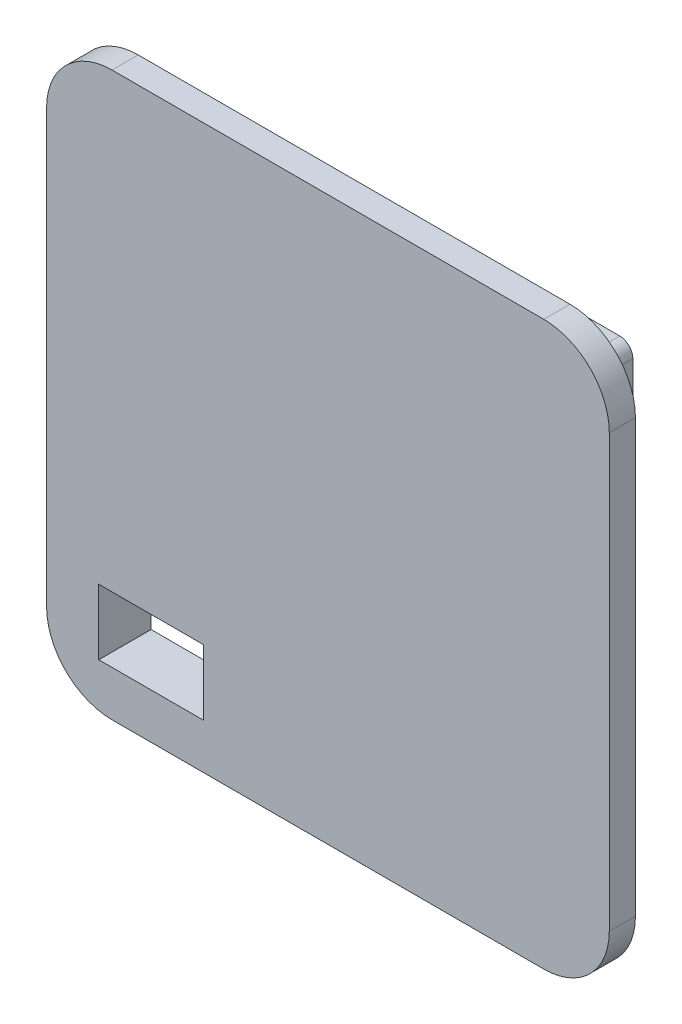
ISO-10303-21;
HEADER;
FILE_DESCRIPTION(('STEP AP214'),'2;1');
FILE_NAME('part.step','',(''),(''),'','','');
FILE_SCHEMA(('AUTOMOTIVE_DESIGN { 1 0 10303 214 1 1 1 1 }'));
ENDSEC;
DATA;
#1=APPLICATION_CONTEXT('core data for automotive mechanical design processes');
#2=APPLICATION_PROTOCOL_DEFINITION('international standard','automotive_design',2000,#1);
#3=PRODUCT_CONTEXT('',#1,'mechanical');
#4=PRODUCT('Part','Part','',(#3));
#5=PRODUCT_RELATED_PRODUCT_CATEGORY('part','',(#4));
#6=PRODUCT_DEFINITION_FORMATION('','',#4);
#7=PRODUCT_DEFINITION_CONTEXT('part definition',#1,'design');
#8=PRODUCT_DEFINITION('design','',#6,#7);
#9=PRODUCT_DEFINITION_SHAPE('','',#8);
#10=(LENGTH_UNIT() NAMED_UNIT(*) SI_UNIT(.MILLI.,.METRE.));
#11=(NAMED_UNIT(*) PLANE_ANGLE_UNIT() SI_UNIT($,.RADIAN.));
#12=(NAMED_UNIT(*) SI_UNIT($,.STERADIAN.) SOLID_ANGLE_UNIT());
#13=UNCERTAINTY_MEASURE_WITH_UNIT(LENGTH_MEASURE(1.E-05),#10,'distance_accuracy_value','');
#14=(GEOMETRIC_REPRESENTATION_CONTEXT(3) GLOBAL_UNCERTAINTY_ASSIGNED_CONTEXT((#13)) GLOBAL_UNIT_ASSIGNED_CONTEXT((#10,
#11,#12)) REPRESENTATION_CONTEXT('',''));
#15=CARTESIAN_POINT('',(0.,0.,0.));
#16=DIRECTION('',(0.,0.,1.));
#17=DIRECTION('',(1.,0.,0.));
#18=AXIS2_PLACEMENT_3D('',#15,#16,#17);
#19=CARTESIAN_POINT('',(21.5,-21.500000053,2.));
#20=DIRECTION('',(0.,1.,0.));
#21=DIRECTION('',(0.,0.,1.));
#22=AXIS2_PLACEMENT_3D('',#19,#20,#21);
#23=PLANE('',#22);
#24=DIRECTION('',(1.,0.,0.));
#25=VECTOR('',#24,1.);
#26=CARTESIAN_POINT('',(21.5,-21.500000053,0.));
#27=LINE('',#26,#25);
#28=CARTESIAN_POINT('',(-16.5,-21.500000053,0.));
#29=VERTEX_POINT('',#28);
#30=CARTESIAN_POINT('',(16.5,-21.500000053,0.));
#31=VERTEX_POINT('',#30);
#32=EDGE_CURVE('E233',#29,#31,#27,.T.);
#33=ORIENTED_EDGE('',*,*,#32,.T.);
#34=DIRECTION('',(0.,0.,-1.));
#35=VECTOR('',#34,1.);
#36=CARTESIAN_POINT('',(16.5,-21.500000053,2.));
#37=LINE('',#36,#35);
#38=CARTESIAN_POINT('',(16.5,-21.500000053,2.));
#39=VERTEX_POINT('',#38);
#40=EDGE_CURVE('E274',#31,#39,#37,.F.);
#41=ORIENTED_EDGE('',*,*,#40,.T.);
#42=DIRECTION('',(1.,0.,0.));
#43=VECTOR('',#42,1.);
#44=CARTESIAN_POINT('',(21.5,-21.500000053,2.));
#45=LINE('',#44,#43);
#46=CARTESIAN_POINT('',(-16.5,-21.500000053,2.));
#47=VERTEX_POINT('',#46);
#48=EDGE_CURVE('E237',#47,#39,#45,.T.);
#49=ORIENTED_EDGE('',*,*,#48,.F.);
#50=DIRECTION('',(0.,0.,-1.));
#51=VECTOR('',#50,1.);
#52=CARTESIAN_POINT('',(-16.5,-21.500000053,2.));
#53=LINE('',#52,#51);
#54=EDGE_CURVE('E275',#47,#29,#53,.T.);
#55=ORIENTED_EDGE('',*,*,#54,.T.);
#56=EDGE_LOOP('',(#33,#41,#49,#55));
#57=FACE_BOUND('',#56,.T.);
#58=ADVANCED_FACE('F41',(#57),#23,.F.);
#59=CARTESIAN_POINT('',(21.5,21.500000053,2.));
#60=DIRECTION('',(-1.,0.,0.));
#61=DIRECTION('',(0.,-1.,0.));
#62=AXIS2_PLACEMENT_3D('',#59,#60,#61);
#63=PLANE('',#62);
#64=DIRECTION('',(0.,1.,0.));
#65=VECTOR('',#64,1.);
#66=CARTESIAN_POINT('',(21.5,21.500000053,2.));
#67=LINE('',#66,#65);
#68=CARTESIAN_POINT('',(21.5,-16.500000053,2.));
#69=VERTEX_POINT('',#68);
#70=CARTESIAN_POINT('',(21.5,16.500000053,2.));
#71=VERTEX_POINT('',#70);
#72=EDGE_CURVE('E239',#69,#71,#67,.T.);
#73=ORIENTED_EDGE('',*,*,#72,.F.);
#74=DIRECTION('',(0.,0.,-1.));
#75=VECTOR('',#74,1.);
#76=CARTESIAN_POINT('',(21.5,-16.500000053,2.));
#77=LINE('',#76,#75);
#78=CARTESIAN_POINT('',(21.5,-16.500000053,0.));
#79=VERTEX_POINT('',#78);
#80=EDGE_CURVE('E261',#69,#79,#77,.T.);
#81=ORIENTED_EDGE('',*,*,#80,.T.);
#82=DIRECTION('',(0.,1.,0.));
#83=VECTOR('',#82,1.);
#84=CARTESIAN_POINT('',(21.5,21.500000053,0.));
#85=LINE('',#84,#83);
#86=CARTESIAN_POINT('',(21.5,16.500000053,0.));
#87=VERTEX_POINT('',#86);
#88=EDGE_CURVE('E252',#79,#87,#85,.T.);
#89=ORIENTED_EDGE('',*,*,#88,.T.);
#90=DIRECTION('',(0.,0.,-1.));
#91=VECTOR('',#90,1.);
#92=CARTESIAN_POINT('',(21.5,16.500000053,2.));
#93=LINE('',#92,#91);
#94=EDGE_CURVE('E249',#87,#71,#93,.F.);
#95=ORIENTED_EDGE('',*,*,#94,.T.);
#96=EDGE_LOOP('',(#73,#81,#89,#95));
#97=FACE_BOUND('',#96,.T.);
#98=ADVANCED_FACE('F374',(#97),#63,.F.);
#99=CARTESIAN_POINT('',(21.5,21.500000053,2.));
#100=DIRECTION('',(0.,-1.,0.));
#101=DIRECTION('',(0.,0.,-1.));
#102=AXIS2_PLACEMENT_3D('',#99,#100,#101);
#103=PLANE('',#102);
#104=DIRECTION('',(-1.,0.,0.));
#105=VECTOR('',#104,1.);
#106=CARTESIAN_POINT('',(21.5,21.500000053,0.));
#107=LINE('',#106,#105);
#108=CARTESIAN_POINT('',(16.5,21.500000053,0.));
#109=VERTEX_POINT('',#108);
#110=CARTESIAN_POINT('',(-16.5,21.500000053,0.));
#111=VERTEX_POINT('',#110);
#112=EDGE_CURVE('E254',#109,#111,#107,.T.);
#113=ORIENTED_EDGE('',*,*,#112,.T.);
#114=DIRECTION('',(0.,0.,-1.));
#115=VECTOR('',#114,1.);
#116=CARTESIAN_POINT('',(-16.5,21.500000053,2.));
#117=LINE('',#116,#115);
#118=CARTESIAN_POINT('',(-16.5,21.500000053,2.));
#119=VERTEX_POINT('',#118);
#120=EDGE_CURVE('E291',#111,#119,#117,.F.);
#121=ORIENTED_EDGE('',*,*,#120,.T.);
#122=DIRECTION('',(-1.,0.,0.));
#123=VECTOR('',#122,1.);
#124=CARTESIAN_POINT('',(21.5,21.500000053,2.));
#125=LINE('',#124,#123);
#126=CARTESIAN_POINT('',(16.5,21.500000053,2.));
#127=VERTEX_POINT('',#126);
#128=EDGE_CURVE('E242',#127,#119,#125,.T.);
#129=ORIENTED_EDGE('',*,*,#128,.F.);
#130=DIRECTION('',(0.,0.,-1.));
#131=VECTOR('',#130,1.);
#132=CARTESIAN_POINT('',(16.5,21.500000053,2.));
#133=LINE('',#132,#131);
#134=EDGE_CURVE('E287',#127,#109,#133,.T.);
#135=ORIENTED_EDGE('',*,*,#134,.T.);
#136=EDGE_LOOP('',(#113,#121,#129,#135));
#137=FACE_BOUND('',#136,.T.);
#138=ADVANCED_FACE('F381',(#137),#103,.F.);
#139=CARTESIAN_POINT('',(-21.5,21.500000053,2.));
#140=DIRECTION('',(1.,0.,0.));
#141=DIRECTION('',(0.,1.,0.));
#142=AXIS2_PLACEMENT_3D('',#139,#140,#141);
#143=PLANE('',#142);
#144=DIRECTION('',(0.,-1.,0.));
#145=VECTOR('',#144,1.);
#146=CARTESIAN_POINT('',(-21.5,21.500000053,0.));
#147=LINE('',#146,#145);
#148=CARTESIAN_POINT('',(-21.5,16.500000053,0.));
#149=VERTEX_POINT('',#148);
#150=CARTESIAN_POINT('',(-21.5,-16.500000053,0.));
#151=VERTEX_POINT('',#150);
#152=EDGE_CURVE('E238',#149,#151,#147,.T.);
#153=ORIENTED_EDGE('',*,*,#152,.T.);
#154=DIRECTION('',(0.,0.,-1.));
#155=VECTOR('',#154,1.);
#156=CARTESIAN_POINT('',(-21.5,-16.500000053,2.));
#157=LINE('',#156,#155);
#158=CARTESIAN_POINT('',(-21.5,-16.500000053,2.));
#159=VERTEX_POINT('',#158);
#160=EDGE_CURVE('E286',#151,#159,#157,.F.);
#161=ORIENTED_EDGE('',*,*,#160,.T.);
#162=DIRECTION('',(0.,-1.,0.));
#163=VECTOR('',#162,1.);
#164=CARTESIAN_POINT('',(-21.5,21.500000053,2.));
#165=LINE('',#164,#163);
#166=CARTESIAN_POINT('',(-21.5,16.500000053,2.));
#167=VERTEX_POINT('',#166);
#168=EDGE_CURVE('E248',#167,#159,#165,.T.);
#169=ORIENTED_EDGE('',*,*,#168,.F.);
#170=DIRECTION('',(0.,0.,-1.));
#171=VECTOR('',#170,1.);
#172=CARTESIAN_POINT('',(-21.5,16.500000053,2.));
#173=LINE('',#172,#171);
#174=EDGE_CURVE('E281',#167,#149,#173,.T.);
#175=ORIENTED_EDGE('',*,*,#174,.T.);
#176=EDGE_LOOP('',(#153,#161,#169,#175));
#177=FACE_BOUND('',#176,.T.);
#178=ADVANCED_FACE('F425',(#177),#143,.F.);
#179=CARTESIAN_POINT('',(0.,0.,2.));
#180=DIRECTION('',(0.,0.,1.));
#181=DIRECTION('',(1.,0.,0.));
#182=AXIS2_PLACEMENT_3D('',#179,#180,#181);
#183=PLANE('',#182);
#184=DIRECTION('',(0.,-1.,0.));
#185=VECTOR('',#184,1.);
#186=CARTESIAN_POINT('',(-17.5127004724193,-18.0345781282387,2.));
#187=LINE('',#186,#185);
#188=CARTESIAN_POINT('',(-17.5127004724193,-13.0345781282387,2.));
#189=VERTEX_POINT('',#188);
#190=CARTESIAN_POINT('',(-17.5127004724193,-18.0345781282387,2.));
#191=VERTEX_POINT('',#190);
#192=EDGE_CURVE('E211',#189,#191,#187,.T.);
#193=ORIENTED_EDGE('',*,*,#192,.F.);
#194=DIRECTION('',(-1.,0.,0.));
#195=VECTOR('',#194,1.);
#196=CARTESIAN_POINT('',(-9.51270047241934,-13.0345781282387,2.));
#197=LINE('',#196,#195);
#198=CARTESIAN_POINT('',(-9.51270047241934,-13.0345781282387,2.));
#199=VERTEX_POINT('',#198);
#200=EDGE_CURVE('E227',#199,#189,#197,.T.);
#201=ORIENTED_EDGE('',*,*,#200,.F.);
#202=DIRECTION('',(0.,1.,0.));
#203=VECTOR('',#202,1.);
#204=CARTESIAN_POINT('',(-9.51270047241934,-18.0345781282387,2.));
#205=LINE('',#204,#203);
#206=CARTESIAN_POINT('',(-9.51270047241934,-18.0345781282387,2.));
#207=VERTEX_POINT('',#206);
#208=EDGE_CURVE('E181',#207,#199,#205,.T.);
#209=ORIENTED_EDGE('',*,*,#208,.F.);
#210=DIRECTION('',(1.,0.,0.));
#211=VECTOR('',#210,1.);
#212=CARTESIAN_POINT('',(-9.51270047241934,-18.0345781282387,2.));
#213=LINE('',#212,#211);
#214=EDGE_CURVE('E221',#191,#207,#213,.T.);
#215=ORIENTED_EDGE('',*,*,#214,.F.);
#216=EDGE_LOOP('',(#193,#201,#209,#215));
#217=FACE_BOUND('',#216,.T.);
#218=ORIENTED_EDGE('',*,*,#48,.T.);
#219=CARTESIAN_POINT('',(16.5,-16.500000053,2.));
#220=DIRECTION('',(0.,0.,1.));
#221=DIRECTION('',(1.,0.,0.));
#222=AXIS2_PLACEMENT_3D('',#219,#220,#221);
#223=CIRCLE('',#222,5.);
#224=EDGE_CURVE('E282',#39,#69,#223,.T.);
#225=ORIENTED_EDGE('',*,*,#224,.T.);
#226=ORIENTED_EDGE('',*,*,#72,.T.);
#227=CARTESIAN_POINT('',(16.5,16.500000053,2.));
#228=DIRECTION('',(0.,0.,1.));
#229=DIRECTION('',(1.,0.,0.));
#230=AXIS2_PLACEMENT_3D('',#227,#228,#229);
#231=CIRCLE('',#230,5.);
#232=EDGE_CURVE('E280',#71,#127,#231,.T.);
#233=ORIENTED_EDGE('',*,*,#232,.T.);
#234=ORIENTED_EDGE('',*,*,#128,.T.);
#235=CARTESIAN_POINT('',(-16.5,16.500000053,2.));
#236=DIRECTION('',(0.,0.,1.));
#237=DIRECTION('',(1.,0.,0.));
#238=AXIS2_PLACEMENT_3D('',#235,#236,#237);
#239=CIRCLE('',#238,5.);
#240=EDGE_CURVE('E276',#119,#167,#239,.T.);
#241=ORIENTED_EDGE('',*,*,#240,.T.);
#242=ORIENTED_EDGE('',*,*,#168,.T.);
#243=CARTESIAN_POINT('',(-16.5,-16.500000053,2.));
#244=DIRECTION('',(0.,0.,1.));
#245=DIRECTION('',(1.,0.,0.));
#246=AXIS2_PLACEMENT_3D('',#243,#244,#245);
#247=CIRCLE('',#246,5.);
#248=EDGE_CURVE('E283',#159,#47,#247,.T.);
#249=ORIENTED_EDGE('',*,*,#248,.T.);
#250=EDGE_LOOP('',(#218,#225,#226,#233,#234,#241,#242,#249));
#251=FACE_BOUND('',#250,.T.);
#252=ADVANCED_FACE('F415',(#217,#251),#183,.T.);
#253=CARTESIAN_POINT('',(0.,0.,0.));
#254=DIRECTION('',(0.,0.,1.));
#255=DIRECTION('',(1.,0.,0.));
#256=AXIS2_PLACEMENT_3D('',#253,#254,#255);
#257=PLANE('',#256);
#258=DIRECTION('',(1.,0.,0.));
#259=VECTOR('',#258,1.);
#260=CARTESIAN_POINT('',(0.,19.3,0.));
#261=LINE('',#260,#259);
#262=CARTESIAN_POINT('',(-18.3,19.3,0.));
#263=VERTEX_POINT('',#262);
#264=CARTESIAN_POINT('',(18.3,19.3,0.));
#265=VERTEX_POINT('',#264);
#266=EDGE_CURVE('E212',#263,#265,#261,.T.);
#267=ORIENTED_EDGE('',*,*,#266,.F.);
#268=CARTESIAN_POINT('',(-18.3,18.3,0.));
#269=DIRECTION('',(0.,0.,1.));
#270=DIRECTION('',(1.,0.,0.));
#271=AXIS2_PLACEMENT_3D('',#268,#269,#270);
#272=CIRCLE('',#271,1.);
#273=CARTESIAN_POINT('',(-19.3,18.3,0.));
#274=VERTEX_POINT('',#273);
#275=EDGE_CURVE('E325',#263,#274,#272,.T.);
#276=ORIENTED_EDGE('',*,*,#275,.T.);
#277=DIRECTION('',(0.,-1.,0.));
#278=VECTOR('',#277,1.);
#279=CARTESIAN_POINT('',(-19.3,0.,0.));
#280=LINE('',#279,#278);
#281=CARTESIAN_POINT('',(-19.3,-18.3,0.));
#282=VERTEX_POINT('',#281);
#283=EDGE_CURVE('E215',#274,#282,#280,.T.);
#284=ORIENTED_EDGE('',*,*,#283,.T.);
#285=CARTESIAN_POINT('',(-18.3,-18.3,0.));
#286=DIRECTION('',(0.,0.,1.));
#287=DIRECTION('',(1.,0.,0.));
#288=AXIS2_PLACEMENT_3D('',#285,#286,#287);
#289=CIRCLE('',#288,1.);
#290=CARTESIAN_POINT('',(-18.3,-19.3,0.));
#291=VERTEX_POINT('',#290);
#292=EDGE_CURVE('E11',#282,#291,#289,.T.);
#293=ORIENTED_EDGE('',*,*,#292,.T.);
#294=DIRECTION('',(1.,0.,0.));
#295=VECTOR('',#294,1.);
#296=CARTESIAN_POINT('',(0.,-19.3,0.));
#297=LINE('',#296,#295);
#298=CARTESIAN_POINT('',(18.3,-19.3,0.));
#299=VERTEX_POINT('',#298);
#300=EDGE_CURVE('E219',#291,#299,#297,.T.);
#301=ORIENTED_EDGE('',*,*,#300,.T.);
#302=CARTESIAN_POINT('',(18.3,-18.3,0.));
#303=DIRECTION('',(0.,0.,1.));
#304=DIRECTION('',(1.,0.,0.));
#305=AXIS2_PLACEMENT_3D('',#302,#303,#304);
#306=CIRCLE('',#305,1.);
#307=CARTESIAN_POINT('',(19.3,-18.3,0.));
#308=VERTEX_POINT('',#307);
#309=EDGE_CURVE('E47',#299,#308,#306,.T.);
#310=ORIENTED_EDGE('',*,*,#309,.T.);
#311=DIRECTION('',(0.,-1.,0.));
#312=VECTOR('',#311,1.);
#313=CARTESIAN_POINT('',(19.3,0.,0.));
#314=LINE('',#313,#312);
#315=CARTESIAN_POINT('',(19.3,18.3,0.));
#316=VERTEX_POINT('',#315);
#317=EDGE_CURVE('E220',#316,#308,#314,.T.);
#318=ORIENTED_EDGE('',*,*,#317,.F.);
#319=CARTESIAN_POINT('',(18.3,18.3,0.));
#320=DIRECTION('',(0.,0.,1.));
#321=DIRECTION('',(1.,0.,0.));
#322=AXIS2_PLACEMENT_3D('',#319,#320,#321);
#323=CIRCLE('',#322,1.);
#324=EDGE_CURVE('E322',#316,#265,#323,.T.);
#325=ORIENTED_EDGE('',*,*,#324,.T.);
#326=EDGE_LOOP('',(#267,#276,#284,#293,#301,#310,#318,#325));
#327=FACE_BOUND('',#326,.T.);
#328=ORIENTED_EDGE('',*,*,#88,.F.);
#329=CARTESIAN_POINT('',(16.5,-16.500000053,0.));
#330=DIRECTION('',(0.,0.,1.));
#331=DIRECTION('',(1.,0.,0.));
#332=AXIS2_PLACEMENT_3D('',#329,#330,#331);
#333=CIRCLE('',#332,5.);
#334=EDGE_CURVE('E269',#79,#31,#333,.F.);
#335=ORIENTED_EDGE('',*,*,#334,.T.);
#336=ORIENTED_EDGE('',*,*,#32,.F.);
#337=CARTESIAN_POINT('',(-16.5,-16.500000053,0.));
#338=DIRECTION('',(0.,0.,1.));
#339=DIRECTION('',(1.,0.,0.));
#340=AXIS2_PLACEMENT_3D('',#337,#338,#339);
#341=CIRCLE('',#340,5.);
#342=EDGE_CURVE('E268',#29,#151,#341,.F.);
#343=ORIENTED_EDGE('',*,*,#342,.T.);
#344=ORIENTED_EDGE('',*,*,#152,.F.);
#345=CARTESIAN_POINT('',(-16.5,16.500000053,0.));
#346=DIRECTION('',(0.,0.,1.));
#347=DIRECTION('',(1.,0.,0.));
#348=AXIS2_PLACEMENT_3D('',#345,#346,#347);
#349=CIRCLE('',#348,5.);
#350=EDGE_CURVE('E266',#149,#111,#349,.F.);
#351=ORIENTED_EDGE('',*,*,#350,.T.);
#352=ORIENTED_EDGE('',*,*,#112,.F.);
#353=CARTESIAN_POINT('',(16.5,16.500000053,0.));
#354=DIRECTION('',(0.,0.,1.));
#355=DIRECTION('',(1.,0.,0.));
#356=AXIS2_PLACEMENT_3D('',#353,#354,#355);
#357=CIRCLE('',#356,5.);
#358=EDGE_CURVE('E262',#109,#87,#357,.F.);
#359=ORIENTED_EDGE('',*,*,#358,.T.);
#360=EDGE_LOOP('',(#328,#335,#336,#343,#344,#351,#352,#359));
#361=FACE_BOUND('',#360,.T.);
#362=ADVANCED_FACE('F330',(#327,#361),#257,.F.);
#363=CARTESIAN_POINT('',(16.5,-16.500000053,2.));
#364=DIRECTION('',(0.,0.,-1.));
#365=DIRECTION('',(-1.,0.,0.));
#366=AXIS2_PLACEMENT_3D('',#363,#364,#365);
#367=CYLINDRICAL_SURFACE('',#366,5.);
#368=ORIENTED_EDGE('',*,*,#224,.F.);
#369=ORIENTED_EDGE('',*,*,#40,.F.);
#370=ORIENTED_EDGE('',*,*,#334,.F.);
#371=ORIENTED_EDGE('',*,*,#80,.F.);
#372=EDGE_LOOP('',(#368,#369,#370,#371));
#373=FACE_BOUND('',#372,.T.);
#374=ADVANCED_FACE('F387',(#373),#367,.T.);
#375=CARTESIAN_POINT('',(-16.5,-16.500000053,2.));
#376=DIRECTION('',(0.,0.,-1.));
#377=DIRECTION('',(-1.,0.,0.));
#378=AXIS2_PLACEMENT_3D('',#375,#376,#377);
#379=CYLINDRICAL_SURFACE('',#378,5.);
#380=ORIENTED_EDGE('',*,*,#248,.F.);
#381=ORIENTED_EDGE('',*,*,#160,.F.);
#382=ORIENTED_EDGE('',*,*,#342,.F.);
#383=ORIENTED_EDGE('',*,*,#54,.F.);
#384=EDGE_LOOP('',(#380,#381,#382,#383));
#385=FACE_BOUND('',#384,.T.);
#386=ADVANCED_FACE('F386',(#385),#379,.T.);
#387=CARTESIAN_POINT('',(-16.5,16.500000053,2.));
#388=DIRECTION('',(0.,0.,-1.));
#389=DIRECTION('',(-1.,0.,0.));
#390=AXIS2_PLACEMENT_3D('',#387,#388,#389);
#391=CYLINDRICAL_SURFACE('',#390,5.);
#392=ORIENTED_EDGE('',*,*,#240,.F.);
#393=ORIENTED_EDGE('',*,*,#120,.F.);
#394=ORIENTED_EDGE('',*,*,#350,.F.);
#395=ORIENTED_EDGE('',*,*,#174,.F.);
#396=EDGE_LOOP('',(#392,#393,#394,#395));
#397=FACE_BOUND('',#396,.T.);
#398=ADVANCED_FACE('F392',(#397),#391,.T.);
#399=CARTESIAN_POINT('',(16.5,16.500000053,2.));
#400=DIRECTION('',(0.,0.,-1.));
#401=DIRECTION('',(-1.,0.,0.));
#402=AXIS2_PLACEMENT_3D('',#399,#400,#401);
#403=CYLINDRICAL_SURFACE('',#402,5.);
#404=ORIENTED_EDGE('',*,*,#232,.F.);
#405=ORIENTED_EDGE('',*,*,#94,.F.);
#406=ORIENTED_EDGE('',*,*,#358,.F.);
#407=ORIENTED_EDGE('',*,*,#134,.F.);
#408=EDGE_LOOP('',(#404,#405,#406,#407));
#409=FACE_BOUND('',#408,.T.);
#410=ADVANCED_FACE('F398',(#409),#403,.T.);
#411=CARTESIAN_POINT('',(-17.5127004724193,-18.0345781282387,0.));
#412=DIRECTION('',(-1.,0.,0.));
#413=DIRECTION('',(0.,0.,1.));
#414=AXIS2_PLACEMENT_3D('',#411,#412,#413);
#415=PLANE('',#414);
#416=ORIENTED_EDGE('',*,*,#192,.T.);
#417=DIRECTION('',(0.,0.,1.));
#418=VECTOR('',#417,1.);
#419=CARTESIAN_POINT('',(-17.5127004724193,-18.0345781282387,0.));
#420=LINE('',#419,#418);
#421=CARTESIAN_POINT('',(-17.5127004724193,-18.0345781282387,-2.));
#422=VERTEX_POINT('',#421);
#423=EDGE_CURVE('E226',#422,#191,#420,.T.);
#424=ORIENTED_EDGE('',*,*,#423,.F.);
#425=DIRECTION('',(0.,-1.,0.));
#426=VECTOR('',#425,1.);
#427=CARTESIAN_POINT('',(-17.5127004724193,0.,-2.));
#428=LINE('',#427,#426);
#429=CARTESIAN_POINT('',(-17.5127004724193,-13.0345781282387,-2.));
#430=VERTEX_POINT('',#429);
#431=EDGE_CURVE('E198',#430,#422,#428,.T.);
#432=ORIENTED_EDGE('',*,*,#431,.F.);
#433=DIRECTION('',(0.,0.,1.));
#434=VECTOR('',#433,1.);
#435=CARTESIAN_POINT('',(-17.5127004724193,-13.0345781282387,0.));
#436=LINE('',#435,#434);
#437=EDGE_CURVE('E189',#430,#189,#436,.T.);
#438=ORIENTED_EDGE('',*,*,#437,.T.);
#439=EDGE_LOOP('',(#416,#424,#432,#438));
#440=FACE_BOUND('',#439,.T.);
#441=ADVANCED_FACE('F399',(#440),#415,.F.);
#442=CARTESIAN_POINT('',(-9.51270047241934,-13.0345781282387,0.));
#443=DIRECTION('',(0.,1.,0.));
#444=DIRECTION('',(-1.,0.,0.));
#445=AXIS2_PLACEMENT_3D('',#442,#443,#444);
#446=PLANE('',#445);
#447=ORIENTED_EDGE('',*,*,#200,.T.);
#448=ORIENTED_EDGE('',*,*,#437,.F.);
#449=DIRECTION('',(-1.,0.,0.));
#450=VECTOR('',#449,1.);
#451=CARTESIAN_POINT('',(0.,-13.0345781282387,-2.));
#452=LINE('',#451,#450);
#453=CARTESIAN_POINT('',(-9.51270047241934,-13.0345781282387,-2.));
#454=VERTEX_POINT('',#453);
#455=EDGE_CURVE('E193',#454,#430,#452,.T.);
#456=ORIENTED_EDGE('',*,*,#455,.F.);
#457=DIRECTION('',(0.,0.,1.));
#458=VECTOR('',#457,1.);
#459=CARTESIAN_POINT('',(-9.51270047241934,-13.0345781282387,0.));
#460=LINE('',#459,#458);
#461=EDGE_CURVE('E180',#454,#199,#460,.T.);
#462=ORIENTED_EDGE('',*,*,#461,.T.);
#463=EDGE_LOOP('',(#447,#448,#456,#462));
#464=FACE_BOUND('',#463,.T.);
#465=ADVANCED_FACE('F195',(#464),#446,.F.);
#466=CARTESIAN_POINT('',(-9.51270047241934,-18.0345781282387,0.));
#467=DIRECTION('',(1.,0.,0.));
#468=DIRECTION('',(0.,0.,-1.));
#469=AXIS2_PLACEMENT_3D('',#466,#467,#468);
#470=PLANE('',#469);
#471=ORIENTED_EDGE('',*,*,#208,.T.);
#472=ORIENTED_EDGE('',*,*,#461,.F.);
#473=DIRECTION('',(0.,1.,0.));
#474=VECTOR('',#473,1.);
#475=CARTESIAN_POINT('',(-9.51270047241934,0.,-2.));
#476=LINE('',#475,#474);
#477=CARTESIAN_POINT('',(-9.51270047241934,-18.0345781282387,-2.));
#478=VERTEX_POINT('',#477);
#479=EDGE_CURVE('E182',#478,#454,#476,.T.);
#480=ORIENTED_EDGE('',*,*,#479,.F.);
#481=DIRECTION('',(0.,0.,1.));
#482=VECTOR('',#481,1.);
#483=CARTESIAN_POINT('',(-9.51270047241934,-18.0345781282387,0.));
#484=LINE('',#483,#482);
#485=EDGE_CURVE('E187',#478,#207,#484,.T.);
#486=ORIENTED_EDGE('',*,*,#485,.T.);
#487=EDGE_LOOP('',(#471,#472,#480,#486));
#488=FACE_BOUND('',#487,.T.);
#489=ADVANCED_FACE('F179',(#488),#470,.F.);
#490=CARTESIAN_POINT('',(-9.51270047241934,-18.0345781282387,0.));
#491=DIRECTION('',(0.,-1.,0.));
#492=DIRECTION('',(0.,0.,-1.));
#493=AXIS2_PLACEMENT_3D('',#490,#491,#492);
#494=PLANE('',#493);
#495=ORIENTED_EDGE('',*,*,#214,.T.);
#496=ORIENTED_EDGE('',*,*,#485,.F.);
#497=DIRECTION('',(1.,0.,0.));
#498=VECTOR('',#497,1.);
#499=CARTESIAN_POINT('',(0.,-18.0345781282387,-2.));
#500=LINE('',#499,#498);
#501=EDGE_CURVE('E203',#422,#478,#500,.T.);
#502=ORIENTED_EDGE('',*,*,#501,.F.);
#503=ORIENTED_EDGE('',*,*,#423,.T.);
#504=EDGE_LOOP('',(#495,#496,#502,#503));
#505=FACE_BOUND('',#504,.T.);
#506=ADVANCED_FACE('F503',(#505),#494,.F.);
#507=CARTESIAN_POINT('',(-19.3,0.,-2.));
#508=DIRECTION('',(-1.,0.,0.));
#509=DIRECTION('',(0.,-1.,0.));
#510=AXIS2_PLACEMENT_3D('',#507,#508,#509);
#511=PLANE('',#510);
#512=ORIENTED_EDGE('',*,*,#283,.F.);
#513=DIRECTION('',(0.,0.,1.));
#514=VECTOR('',#513,1.);
#515=CARTESIAN_POINT('',(-19.3,18.3,-2.));
#516=LINE('',#515,#514);
#517=CARTESIAN_POINT('',(-19.3,18.3,-2.));
#518=VERTEX_POINT('',#517);
#519=EDGE_CURVE('E301',#274,#518,#516,.F.);
#520=ORIENTED_EDGE('',*,*,#519,.T.);
#521=DIRECTION('',(0.,-1.,0.));
#522=VECTOR('',#521,1.);
#523=CARTESIAN_POINT('',(-19.3,0.,-2.));
#524=LINE('',#523,#522);
#525=CARTESIAN_POINT('',(-19.3,-18.3,-2.));
#526=VERTEX_POINT('',#525);
#527=EDGE_CURVE('E225',#518,#526,#524,.T.);
#528=ORIENTED_EDGE('',*,*,#527,.T.);
#529=DIRECTION('',(0.,0.,1.));
#530=VECTOR('',#529,1.);
#531=CARTESIAN_POINT('',(-19.3,-18.3,-2.));
#532=LINE('',#531,#530);
#533=EDGE_CURVE('E296',#526,#282,#532,.T.);
#534=ORIENTED_EDGE('',*,*,#533,.T.);
#535=EDGE_LOOP('',(#512,#520,#528,#534));
#536=FACE_BOUND('',#535,.T.);
#537=ADVANCED_FACE('F349',(#536),#511,.T.);
#538=CARTESIAN_POINT('',(0.,19.3,-2.));
#539=DIRECTION('',(0.,-1.,0.));
#540=DIRECTION('',(0.,0.,-1.));
#541=AXIS2_PLACEMENT_3D('',#538,#539,#540);
#542=PLANE('',#541);
#543=DIRECTION('',(1.,0.,0.));
#544=VECTOR('',#543,1.);
#545=CARTESIAN_POINT('',(0.,19.3,-2.));
#546=LINE('',#545,#544);
#547=CARTESIAN_POINT('',(-18.3,19.3,-2.));
#548=VERTEX_POINT('',#547);
#549=CARTESIAN_POINT('',(18.3,19.3,-2.));
#550=VERTEX_POINT('',#549);
#551=EDGE_CURVE('E353',#548,#550,#546,.T.);
#552=ORIENTED_EDGE('',*,*,#551,.F.);
#553=DIRECTION('',(0.,0.,1.));
#554=VECTOR('',#553,1.);
#555=CARTESIAN_POINT('',(-18.3,19.3,0.));
#556=LINE('',#555,#554);
#557=EDGE_CURVE('E299',#548,#263,#556,.T.);
#558=ORIENTED_EDGE('',*,*,#557,.T.);
#559=ORIENTED_EDGE('',*,*,#266,.T.);
#560=DIRECTION('',(0.,0.,1.));
#561=VECTOR('',#560,1.);
#562=CARTESIAN_POINT('',(18.3,19.3,-2.));
#563=LINE('',#562,#561);
#564=EDGE_CURVE('E293',#265,#550,#563,.F.);
#565=ORIENTED_EDGE('',*,*,#564,.T.);
#566=EDGE_LOOP('',(#552,#558,#559,#565));
#567=FACE_BOUND('',#566,.T.);
#568=ADVANCED_FACE('F362',(#567),#542,.F.);
#569=CARTESIAN_POINT('',(19.3,0.,-2.));
#570=DIRECTION('',(-1.,0.,0.));
#571=DIRECTION('',(0.,-1.,0.));
#572=AXIS2_PLACEMENT_3D('',#569,#570,#571);
#573=PLANE('',#572);
#574=DIRECTION('',(0.,-1.,0.));
#575=VECTOR('',#574,1.);
#576=CARTESIAN_POINT('',(19.3,0.,-2.));
#577=LINE('',#576,#575);
#578=CARTESIAN_POINT('',(19.3,18.3,-2.));
#579=VERTEX_POINT('',#578);
#580=CARTESIAN_POINT('',(19.3,-18.3,-2.));
#581=VERTEX_POINT('',#580);
#582=EDGE_CURVE('E202',#579,#581,#577,.T.);
#583=ORIENTED_EDGE('',*,*,#582,.F.);
#584=DIRECTION('',(0.,0.,1.));
#585=VECTOR('',#584,1.);
#586=CARTESIAN_POINT('',(19.3,18.3,-2.));
#587=LINE('',#586,#585);
#588=EDGE_CURVE('E312',#579,#316,#587,.T.);
#589=ORIENTED_EDGE('',*,*,#588,.T.);
#590=ORIENTED_EDGE('',*,*,#317,.T.);
#591=DIRECTION('',(0.,0.,1.));
#592=VECTOR('',#591,1.);
#593=CARTESIAN_POINT('',(19.3,-18.3,-2.));
#594=LINE('',#593,#592);
#595=EDGE_CURVE('E311',#308,#581,#594,.F.);
#596=ORIENTED_EDGE('',*,*,#595,.T.);
#597=EDGE_LOOP('',(#583,#589,#590,#596));
#598=FACE_BOUND('',#597,.T.);
#599=ADVANCED_FACE('F332',(#598),#573,.F.);
#600=CARTESIAN_POINT('',(0.,-19.3,-2.));
#601=DIRECTION('',(0.,-1.,0.));
#602=DIRECTION('',(1.,0.,0.));
#603=AXIS2_PLACEMENT_3D('',#600,#601,#602);
#604=PLANE('',#603);
#605=DIRECTION('',(1.,0.,0.));
#606=VECTOR('',#605,1.);
#607=CARTESIAN_POINT('',(0.,-19.3,-2.));
#608=LINE('',#607,#606);
#609=CARTESIAN_POINT('',(-18.3,-19.3,-2.));
#610=VERTEX_POINT('',#609);
#611=CARTESIAN_POINT('',(18.3,-19.3,-2.));
#612=VERTEX_POINT('',#611);
#613=EDGE_CURVE('E205',#610,#612,#608,.T.);
#614=ORIENTED_EDGE('',*,*,#613,.T.);
#615=DIRECTION('',(0.,0.,1.));
#616=VECTOR('',#615,1.);
#617=CARTESIAN_POINT('',(18.3,-19.3,0.));
#618=LINE('',#617,#616);
#619=EDGE_CURVE('E319',#612,#299,#618,.T.);
#620=ORIENTED_EDGE('',*,*,#619,.T.);
#621=ORIENTED_EDGE('',*,*,#300,.F.);
#622=DIRECTION('',(0.,0.,1.));
#623=VECTOR('',#622,1.);
#624=CARTESIAN_POINT('',(-18.3,-19.3,-2.));
#625=LINE('',#624,#623);
#626=EDGE_CURVE('E318',#291,#610,#625,.F.);
#627=ORIENTED_EDGE('',*,*,#626,.T.);
#628=EDGE_LOOP('',(#614,#620,#621,#627));
#629=FACE_BOUND('',#628,.T.);
#630=ADVANCED_FACE('F343',(#629),#604,.T.);
#631=CARTESIAN_POINT('',(0.,0.,-2.));
#632=DIRECTION('',(0.,0.,-1.));
#633=DIRECTION('',(-1.,0.,0.));
#634=AXIS2_PLACEMENT_3D('',#631,#632,#633);
#635=PLANE('',#634);
#636=ORIENTED_EDGE('',*,*,#527,.F.);
#637=CARTESIAN_POINT('',(-18.3,18.3,-2.));
#638=DIRECTION('',(0.,0.,-1.));
#639=DIRECTION('',(-1.,0.,0.));
#640=AXIS2_PLACEMENT_3D('',#637,#638,#639);
#641=CIRCLE('',#640,1.);
#642=EDGE_CURVE('E313',#518,#548,#641,.T.);
#643=ORIENTED_EDGE('',*,*,#642,.T.);
#644=ORIENTED_EDGE('',*,*,#551,.T.);
#645=CARTESIAN_POINT('',(18.3,18.3,-2.));
#646=DIRECTION('',(0.,0.,-1.));
#647=DIRECTION('',(-1.,0.,0.));
#648=AXIS2_PLACEMENT_3D('',#645,#646,#647);
#649=CIRCLE('',#648,1.);
#650=EDGE_CURVE('E310',#550,#579,#649,.T.);
#651=ORIENTED_EDGE('',*,*,#650,.T.);
#652=ORIENTED_EDGE('',*,*,#582,.T.);
#653=CARTESIAN_POINT('',(18.3,-18.3,-2.));
#654=DIRECTION('',(0.,0.,-1.));
#655=DIRECTION('',(-1.,0.,0.));
#656=AXIS2_PLACEMENT_3D('',#653,#654,#655);
#657=CIRCLE('',#656,1.);
#658=EDGE_CURVE('E307',#581,#612,#657,.T.);
#659=ORIENTED_EDGE('',*,*,#658,.T.);
#660=ORIENTED_EDGE('',*,*,#613,.F.);
#661=CARTESIAN_POINT('',(-18.3,-18.3,-2.));
#662=DIRECTION('',(0.,0.,-1.));
#663=DIRECTION('',(-1.,0.,0.));
#664=AXIS2_PLACEMENT_3D('',#661,#662,#663);
#665=CIRCLE('',#664,1.);
#666=EDGE_CURVE('E302',#610,#526,#665,.T.);
#667=ORIENTED_EDGE('',*,*,#666,.T.);
#668=EDGE_LOOP('',(#636,#643,#644,#651,#652,#659,#660,#667));
#669=FACE_BOUND('',#668,.T.);
#670=ORIENTED_EDGE('',*,*,#479,.T.);
#671=ORIENTED_EDGE('',*,*,#455,.T.);
#672=ORIENTED_EDGE('',*,*,#431,.T.);
#673=ORIENTED_EDGE('',*,*,#501,.T.);
#674=EDGE_LOOP('',(#670,#671,#672,#673));
#675=FACE_BOUND('',#674,.T.);
#676=ADVANCED_FACE('F200',(#669,#675),#635,.T.);
#677=CARTESIAN_POINT('',(-18.3,18.3,-2.));
#678=DIRECTION('',(0.,0.,-1.));
#679=DIRECTION('',(-1.,0.,0.));
#680=AXIS2_PLACEMENT_3D('',#677,#678,#679);
#681=CYLINDRICAL_SURFACE('',#680,1.);
#682=ORIENTED_EDGE('',*,*,#642,.F.);
#683=ORIENTED_EDGE('',*,*,#519,.F.);
#684=ORIENTED_EDGE('',*,*,#275,.F.);
#685=ORIENTED_EDGE('',*,*,#557,.F.);
#686=EDGE_LOOP('',(#682,#683,#684,#685));
#687=FACE_BOUND('',#686,.T.);
#688=ADVANCED_FACE('F365',(#687),#681,.T.);
#689=CARTESIAN_POINT('',(18.3,18.3,-2.));
#690=DIRECTION('',(0.,0.,1.));
#691=DIRECTION('',(1.,0.,0.));
#692=AXIS2_PLACEMENT_3D('',#689,#690,#691);
#693=CYLINDRICAL_SURFACE('',#692,1.);
#694=ORIENTED_EDGE('',*,*,#650,.F.);
#695=ORIENTED_EDGE('',*,*,#564,.F.);
#696=ORIENTED_EDGE('',*,*,#324,.F.);
#697=ORIENTED_EDGE('',*,*,#588,.F.);
#698=EDGE_LOOP('',(#694,#695,#696,#697));
#699=FACE_BOUND('',#698,.T.);
#700=ADVANCED_FACE('F363',(#699),#693,.T.);
#701=CARTESIAN_POINT('',(18.3,-18.3,-2.));
#702=DIRECTION('',(0.,0.,-1.));
#703=DIRECTION('',(-1.,0.,0.));
#704=AXIS2_PLACEMENT_3D('',#701,#702,#703);
#705=CYLINDRICAL_SURFACE('',#704,1.);
#706=ORIENTED_EDGE('',*,*,#658,.F.);
#707=ORIENTED_EDGE('',*,*,#595,.F.);
#708=ORIENTED_EDGE('',*,*,#309,.F.);
#709=ORIENTED_EDGE('',*,*,#619,.F.);
#710=EDGE_LOOP('',(#706,#707,#708,#709));
#711=FACE_BOUND('',#710,.T.);
#712=ADVANCED_FACE('F333',(#711),#705,.T.);
#713=CARTESIAN_POINT('',(-18.3,-18.3,-2.));
#714=DIRECTION('',(0.,0.,1.));
#715=DIRECTION('',(1.,0.,0.));
#716=AXIS2_PLACEMENT_3D('',#713,#714,#715);
#717=CYLINDRICAL_SURFACE('',#716,1.);
#718=ORIENTED_EDGE('',*,*,#666,.F.);
#719=ORIENTED_EDGE('',*,*,#626,.F.);
#720=ORIENTED_EDGE('',*,*,#292,.F.);
#721=ORIENTED_EDGE('',*,*,#533,.F.);
#722=EDGE_LOOP('',(#718,#719,#720,#721));
#723=FACE_BOUND('',#722,.T.);
#724=ADVANCED_FACE('F43',(#723),#717,.T.);
#725=CLOSED_SHELL('',(#58,#98,#138,#178,#252,#362,#374,#386,#398,#410,#441,#465,#489,#506,#537,
#568,#599,#630,#676,#688,#700,#712,#724));
#726=MANIFOLD_SOLID_BREP('B2',#725);
#727=ADVANCED_BREP_SHAPE_REPRESENTATION('',(#18,#726),#14);
#728=SHAPE_DEFINITION_REPRESENTATION(#9,#727);
ENDSEC;
END-ISO-10303-21;
